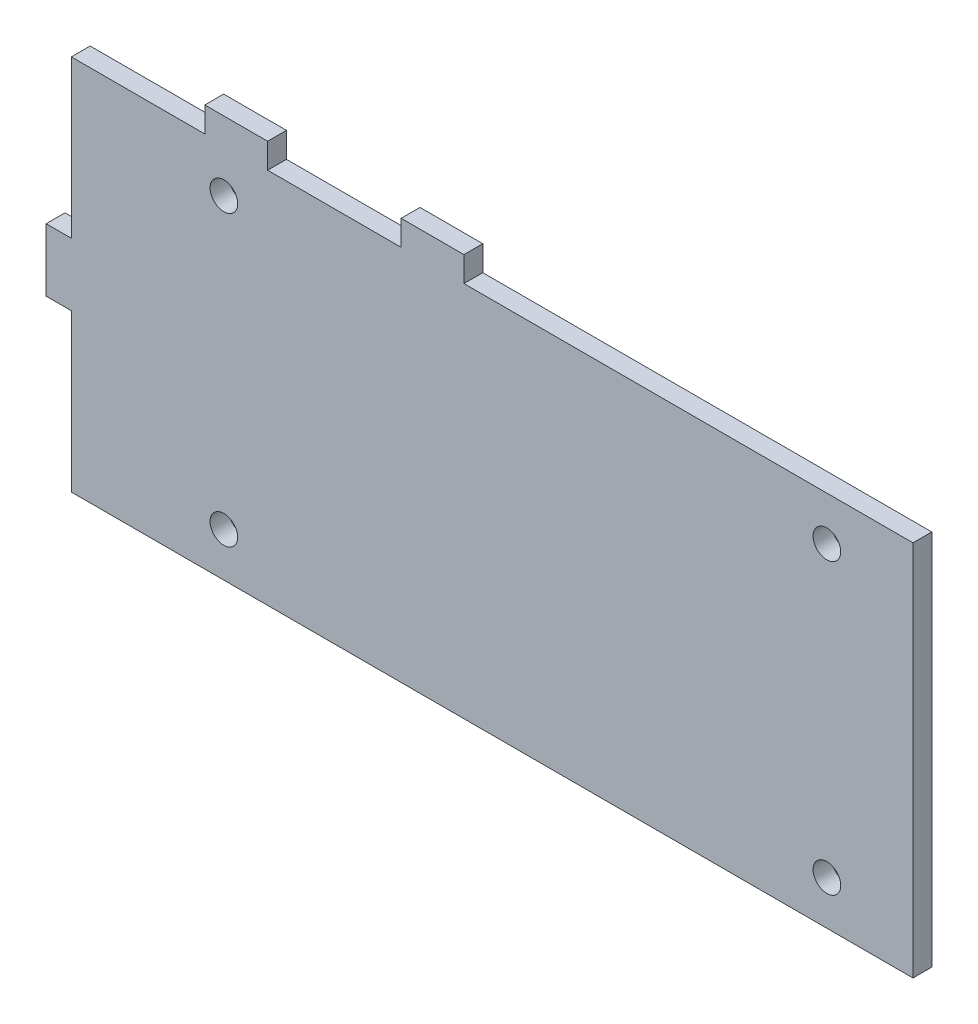
ISO-10303-21;
HEADER;
FILE_DESCRIPTION(('STEP AP214'),'2;1');
FILE_NAME('part.step','',(''),(''),'','','');
FILE_SCHEMA(('AUTOMOTIVE_DESIGN { 1 0 10303 214 1 1 1 1 }'));
ENDSEC;
DATA;
#1=APPLICATION_CONTEXT('core data for automotive mechanical design processes');
#2=APPLICATION_PROTOCOL_DEFINITION('international standard','automotive_design',2000,#1);
#3=PRODUCT_CONTEXT('',#1,'mechanical');
#4=PRODUCT('Part','Part','',(#3));
#5=PRODUCT_RELATED_PRODUCT_CATEGORY('part','',(#4));
#6=PRODUCT_DEFINITION_FORMATION('','',#4);
#7=PRODUCT_DEFINITION_CONTEXT('part definition',#1,'design');
#8=PRODUCT_DEFINITION('design','',#6,#7);
#9=PRODUCT_DEFINITION_SHAPE('','',#8);
#10=(LENGTH_UNIT() NAMED_UNIT(*) SI_UNIT(.MILLI.,.METRE.));
#11=(NAMED_UNIT(*) PLANE_ANGLE_UNIT() SI_UNIT($,.RADIAN.));
#12=(NAMED_UNIT(*) SI_UNIT($,.STERADIAN.) SOLID_ANGLE_UNIT());
#13=UNCERTAINTY_MEASURE_WITH_UNIT(LENGTH_MEASURE(1.E-05),#10,'distance_accuracy_value','');
#14=(GEOMETRIC_REPRESENTATION_CONTEXT(3) GLOBAL_UNCERTAINTY_ASSIGNED_CONTEXT((#13)) GLOBAL_UNIT_ASSIGNED_CONTEXT((#10,
#11,#12)) REPRESENTATION_CONTEXT('',''));
#15=CARTESIAN_POINT('',(0.,0.,0.));
#16=DIRECTION('',(0.,0.,1.));
#17=DIRECTION('',(1.,0.,0.));
#18=AXIS2_PLACEMENT_3D('',#15,#16,#17);
#19=CARTESIAN_POINT('',(11.8535533905939,-11.,13.5000000000004));
#20=DIRECTION('',(-1.,0.,0.));
#21=DIRECTION('',(0.,-1.,0.));
#22=AXIS2_PLACEMENT_3D('',#19,#20,#21);
#23=PLANE('',#22);
#24=DIRECTION('',(0.,-1.,0.));
#25=VECTOR('',#24,1.);
#26=CARTESIAN_POINT('',(11.8535533905939,-11.,13.5000000000004));
#27=LINE('',#26,#25);
#28=CARTESIAN_POINT('',(11.8535533905939,-11.,13.5000000000004));
#29=VERTEX_POINT('',#28);
#30=CARTESIAN_POINT('',(11.8535533905939,-23.5,13.5000000000004));
#31=VERTEX_POINT('',#30);
#32=EDGE_CURVE('E218',#29,#31,#27,.T.);
#33=ORIENTED_EDGE('',*,*,#32,.T.);
#34=DIRECTION('',(0.,0.,1.));
#35=VECTOR('',#34,1.);
#36=CARTESIAN_POINT('',(11.8535533905939,-23.5,13.5000000000004));
#37=LINE('',#36,#35);
#38=CARTESIAN_POINT('',(11.8535533905939,-23.5,15.0000000000004));
#39=VERTEX_POINT('',#38);
#40=EDGE_CURVE('E209',#31,#39,#37,.T.);
#41=ORIENTED_EDGE('',*,*,#40,.T.);
#42=DIRECTION('',(0.,-1.,0.));
#43=VECTOR('',#42,1.);
#44=CARTESIAN_POINT('',(11.8535533905939,-11.,15.0000000000004));
#45=LINE('',#44,#43);
#46=CARTESIAN_POINT('',(11.8535533905939,-11.,15.0000000000004));
#47=VERTEX_POINT('',#46);
#48=EDGE_CURVE('E239',#47,#39,#45,.T.);
#49=ORIENTED_EDGE('',*,*,#48,.F.);
#50=DIRECTION('',(0.,0.,1.));
#51=VECTOR('',#50,1.);
#52=CARTESIAN_POINT('',(11.8535533905939,-11.,13.5000000000004));
#53=LINE('',#52,#51);
#54=EDGE_CURVE('E11',#29,#47,#53,.T.);
#55=ORIENTED_EDGE('',*,*,#54,.F.);
#56=EDGE_LOOP('',(#33,#41,#49,#55));
#57=FACE_BOUND('',#56,.T.);
#58=ADVANCED_FACE('F44',(#57),#23,.T.);
#59=CARTESIAN_POINT('',(11.8535533905939,-11.,13.5000000000004));
#60=DIRECTION('',(0.,1.,0.));
#61=DIRECTION('',(0.,0.,1.));
#62=AXIS2_PLACEMENT_3D('',#59,#60,#61);
#63=PLANE('',#62);
#64=DIRECTION('',(0.,0.,1.));
#65=VECTOR('',#64,1.);
#66=CARTESIAN_POINT('',(38.1089177968646,-11.,13.5000000000004));
#67=LINE('',#66,#65);
#68=CARTESIAN_POINT('',(38.1089177968646,-11.,13.5000000000004));
#69=VERTEX_POINT('',#68);
#70=CARTESIAN_POINT('',(38.1089177968646,-11.,15.0000000000004));
#71=VERTEX_POINT('',#70);
#72=EDGE_CURVE('E293',#69,#71,#67,.T.);
#73=ORIENTED_EDGE('',*,*,#72,.F.);
#74=DIRECTION('',(-1.,0.,0.));
#75=VECTOR('',#74,1.);
#76=CARTESIAN_POINT('',(11.8535533905939,-11.,13.5000000000004));
#77=LINE('',#76,#75);
#78=CARTESIAN_POINT('',(27.4812355937292,-11.,13.5000000000004));
#79=VERTEX_POINT('',#78);
#80=EDGE_CURVE('E238',#69,#79,#77,.T.);
#81=ORIENTED_EDGE('',*,*,#80,.T.);
#82=DIRECTION('',(0.,0.,1.));
#83=VECTOR('',#82,1.);
#84=CARTESIAN_POINT('',(27.4812355937292,-11.,13.5000000000004));
#85=LINE('',#84,#83);
#86=CARTESIAN_POINT('',(27.4812355937292,-11.,15.0000000000004));
#87=VERTEX_POINT('',#86);
#88=EDGE_CURVE('E264',#79,#87,#85,.T.);
#89=ORIENTED_EDGE('',*,*,#88,.T.);
#90=DIRECTION('',(-1.,0.,0.));
#91=VECTOR('',#90,1.);
#92=CARTESIAN_POINT('',(11.8535533905939,-11.,15.0000000000004));
#93=LINE('',#92,#91);
#94=EDGE_CURVE('E223',#71,#87,#93,.T.);
#95=ORIENTED_EDGE('',*,*,#94,.F.);
#96=EDGE_LOOP('',(#73,#81,#89,#95));
#97=FACE_BOUND('',#96,.T.);
#98=ADVANCED_FACE('F361',(#97),#63,.T.);
#99=DIRECTION('',(0.,0.,1.));
#100=VECTOR('',#99,1.);
#101=CARTESIAN_POINT('',(43.1089177968646,-11.,13.5000000000004));
#102=LINE('',#101,#100);
#103=CARTESIAN_POINT('',(43.1089177968646,-11.,13.5000000000004));
#104=VERTEX_POINT('',#103);
#105=CARTESIAN_POINT('',(43.1089177968646,-11.,15.0000000000004));
#106=VERTEX_POINT('',#105);
#107=EDGE_CURVE('E295',#104,#106,#102,.T.);
#108=ORIENTED_EDGE('',*,*,#107,.T.);
#109=CARTESIAN_POINT('',(78.8535533905939,-11.,15.0000000000004));
#110=VERTEX_POINT('',#109);
#111=EDGE_CURVE('E219',#110,#106,#93,.T.);
#112=ORIENTED_EDGE('',*,*,#111,.F.);
#113=DIRECTION('',(0.,0.,1.));
#114=VECTOR('',#113,1.);
#115=CARTESIAN_POINT('',(78.8535533905939,-11.,13.5000000000004));
#116=LINE('',#115,#114);
#117=CARTESIAN_POINT('',(78.8535533905939,-11.,13.5000000000004));
#118=VERTEX_POINT('',#117);
#119=EDGE_CURVE('E53',#118,#110,#116,.T.);
#120=ORIENTED_EDGE('',*,*,#119,.F.);
#121=EDGE_CURVE('E235',#118,#104,#77,.T.);
#122=ORIENTED_EDGE('',*,*,#121,.T.);
#123=EDGE_LOOP('',(#108,#112,#120,#122));
#124=FACE_BOUND('',#123,.T.);
#125=ADVANCED_FACE('F382',(#124),#63,.T.);
#126=DIRECTION('',(0.,0.,1.));
#127=VECTOR('',#126,1.);
#128=CARTESIAN_POINT('',(11.8535533905939,-28.5,13.5000000000004));
#129=LINE('',#128,#127);
#130=CARTESIAN_POINT('',(11.8535533905939,-28.5,13.5000000000004));
#131=VERTEX_POINT('',#130);
#132=CARTESIAN_POINT('',(11.8535533905939,-28.5,15.0000000000004));
#133=VERTEX_POINT('',#132);
#134=EDGE_CURVE('E193',#131,#133,#129,.T.);
#135=ORIENTED_EDGE('',*,*,#134,.F.);
#136=CARTESIAN_POINT('',(11.8535533905939,-41.,13.5000000000004));
#137=VERTEX_POINT('',#136);
#138=EDGE_CURVE('E206',#131,#137,#27,.T.);
#139=ORIENTED_EDGE('',*,*,#138,.T.);
#140=DIRECTION('',(0.,0.,1.));
#141=VECTOR('',#140,1.);
#142=CARTESIAN_POINT('',(11.8535533905939,-41.,13.5000000000004));
#143=LINE('',#142,#141);
#144=CARTESIAN_POINT('',(11.8535533905939,-41.,15.0000000000004));
#145=VERTEX_POINT('',#144);
#146=EDGE_CURVE('E48',#137,#145,#143,.T.);
#147=ORIENTED_EDGE('',*,*,#146,.T.);
#148=EDGE_CURVE('E208',#133,#145,#45,.T.);
#149=ORIENTED_EDGE('',*,*,#148,.F.);
#150=EDGE_LOOP('',(#135,#139,#147,#149));
#151=FACE_BOUND('',#150,.T.);
#152=ADVANCED_FACE('F46',(#151),#23,.T.);
#153=DIRECTION('',(0.,0.,1.));
#154=VECTOR('',#153,1.);
#155=CARTESIAN_POINT('',(22.4812355937292,-11.,13.5000000000004));
#156=LINE('',#155,#154);
#157=CARTESIAN_POINT('',(22.4812355937292,-11.,13.5000000000004));
#158=VERTEX_POINT('',#157);
#159=CARTESIAN_POINT('',(22.4812355937292,-11.,15.0000000000004));
#160=VERTEX_POINT('',#159);
#161=EDGE_CURVE('E228',#158,#160,#156,.T.);
#162=ORIENTED_EDGE('',*,*,#161,.F.);
#163=EDGE_CURVE('E234',#158,#29,#77,.T.);
#164=ORIENTED_EDGE('',*,*,#163,.T.);
#165=ORIENTED_EDGE('',*,*,#54,.T.);
#166=EDGE_CURVE('E225',#160,#47,#93,.T.);
#167=ORIENTED_EDGE('',*,*,#166,.F.);
#168=EDGE_LOOP('',(#162,#164,#165,#167));
#169=FACE_BOUND('',#168,.T.);
#170=ADVANCED_FACE('F384',(#169),#63,.T.);
#171=CARTESIAN_POINT('',(78.8535533905939,-11.,13.5000000000004));
#172=DIRECTION('',(1.,0.,0.));
#173=DIRECTION('',(0.,0.,-1.));
#174=AXIS2_PLACEMENT_3D('',#171,#172,#173);
#175=PLANE('',#174);
#176=DIRECTION('',(0.,1.,0.));
#177=VECTOR('',#176,1.);
#178=CARTESIAN_POINT('',(78.8535533905939,-11.,15.0000000000004));
#179=LINE('',#178,#177);
#180=CARTESIAN_POINT('',(78.8535533905939,-41.,15.0000000000004));
#181=VERTEX_POINT('',#180);
#182=EDGE_CURVE('E245',#181,#110,#179,.T.);
#183=ORIENTED_EDGE('',*,*,#182,.F.);
#184=DIRECTION('',(0.,0.,1.));
#185=VECTOR('',#184,1.);
#186=CARTESIAN_POINT('',(78.8535533905939,-41.,13.5000000000004));
#187=LINE('',#186,#185);
#188=CARTESIAN_POINT('',(78.8535533905939,-41.,13.5000000000004));
#189=VERTEX_POINT('',#188);
#190=EDGE_CURVE('E248',#189,#181,#187,.T.);
#191=ORIENTED_EDGE('',*,*,#190,.F.);
#192=DIRECTION('',(0.,1.,0.));
#193=VECTOR('',#192,1.);
#194=CARTESIAN_POINT('',(78.8535533905939,-11.,13.5000000000004));
#195=LINE('',#194,#193);
#196=EDGE_CURVE('E231',#189,#118,#195,.T.);
#197=ORIENTED_EDGE('',*,*,#196,.T.);
#198=ORIENTED_EDGE('',*,*,#119,.T.);
#199=EDGE_LOOP('',(#183,#191,#197,#198));
#200=FACE_BOUND('',#199,.T.);
#201=ADVANCED_FACE('F390',(#200),#175,.T.);
#202=CARTESIAN_POINT('',(11.8535533905939,-41.,13.5000000000004));
#203=DIRECTION('',(0.,-1.,0.));
#204=DIRECTION('',(0.,0.,-1.));
#205=AXIS2_PLACEMENT_3D('',#202,#203,#204);
#206=PLANE('',#205);
#207=DIRECTION('',(1.,0.,0.));
#208=VECTOR('',#207,1.);
#209=CARTESIAN_POINT('',(11.8535533905939,-41.,15.0000000000004));
#210=LINE('',#209,#208);
#211=EDGE_CURVE('E242',#145,#181,#210,.T.);
#212=ORIENTED_EDGE('',*,*,#211,.F.);
#213=ORIENTED_EDGE('',*,*,#146,.F.);
#214=DIRECTION('',(1.,0.,0.));
#215=VECTOR('',#214,1.);
#216=CARTESIAN_POINT('',(11.8535533905939,-41.,13.5000000000004));
#217=LINE('',#216,#215);
#218=EDGE_CURVE('E217',#137,#189,#217,.T.);
#219=ORIENTED_EDGE('',*,*,#218,.T.);
#220=ORIENTED_EDGE('',*,*,#190,.T.);
#221=EDGE_LOOP('',(#212,#213,#219,#220));
#222=FACE_BOUND('',#221,.T.);
#223=ADVANCED_FACE('F252',(#222),#206,.T.);
#224=CARTESIAN_POINT('',(0.,0.,13.5000000000004));
#225=DIRECTION('',(0.,0.,1.));
#226=DIRECTION('',(1.,0.,0.));
#227=AXIS2_PLACEMENT_3D('',#224,#225,#226);
#228=PLANE('',#227);
#229=CARTESIAN_POINT('',(72.0000000000018,-37.4999999999996,13.5000000000004));
#230=DIRECTION('',(0.,0.,1.));
#231=DIRECTION('',(1.,0.,0.));
#232=AXIS2_PLACEMENT_3D('',#229,#230,#231);
#233=CIRCLE('',#232,1.09999999999999);
#234=CARTESIAN_POINT('',(73.1000000000018,-37.4999999999996,13.5000000000004));
#235=VERTEX_POINT('',#234);
#236=EDGE_CURVE('E333',#235,#235,#233,.T.);
#237=ORIENTED_EDGE('',*,*,#236,.T.);
#238=EDGE_LOOP('',(#237));
#239=FACE_BOUND('',#238,.T.);
#240=CARTESIAN_POINT('',(24.0000000000018,-37.4999999999996,13.5000000000004));
#241=DIRECTION('',(0.,0.,1.));
#242=DIRECTION('',(1.,0.,0.));
#243=AXIS2_PLACEMENT_3D('',#240,#241,#242);
#244=CIRCLE('',#243,1.09999999999999);
#245=CARTESIAN_POINT('',(25.1000000000018,-37.4999999999996,13.5000000000004));
#246=VERTEX_POINT('',#245);
#247=EDGE_CURVE('E327',#246,#246,#244,.T.);
#248=ORIENTED_EDGE('',*,*,#247,.T.);
#249=EDGE_LOOP('',(#248));
#250=FACE_BOUND('',#249,.T.);
#251=CARTESIAN_POINT('',(72.0000000000018,-14.4999999999995,13.5000000000004));
#252=DIRECTION('',(0.,0.,1.));
#253=DIRECTION('',(1.,0.,0.));
#254=AXIS2_PLACEMENT_3D('',#251,#252,#253);
#255=CIRCLE('',#254,1.09999999999999);
#256=CARTESIAN_POINT('',(73.1000000000018,-14.4999999999995,13.5000000000004));
#257=VERTEX_POINT('',#256);
#258=EDGE_CURVE('E321',#257,#257,#255,.T.);
#259=ORIENTED_EDGE('',*,*,#258,.T.);
#260=EDGE_LOOP('',(#259));
#261=FACE_BOUND('',#260,.T.);
#262=CARTESIAN_POINT('',(24.0000000000018,-14.4999999999995,13.5000000000004));
#263=DIRECTION('',(0.,0.,1.));
#264=DIRECTION('',(1.,0.,0.));
#265=AXIS2_PLACEMENT_3D('',#262,#263,#264);
#266=CIRCLE('',#265,1.09999999999999);
#267=CARTESIAN_POINT('',(25.1000000000018,-14.4999999999995,13.5000000000004));
#268=VERTEX_POINT('',#267);
#269=EDGE_CURVE('E309',#268,#268,#266,.T.);
#270=ORIENTED_EDGE('',*,*,#269,.T.);
#271=EDGE_LOOP('',(#270));
#272=FACE_BOUND('',#271,.T.);
#273=ORIENTED_EDGE('',*,*,#32,.F.);
#274=ORIENTED_EDGE('',*,*,#163,.F.);
#275=DIRECTION('',(0.,-1.,0.));
#276=VECTOR('',#275,1.);
#277=CARTESIAN_POINT('',(22.4812355937292,-11.,13.5000000000004));
#278=LINE('',#277,#276);
#279=CARTESIAN_POINT('',(22.4812355937292,-8.99999999999997,13.5000000000004));
#280=VERTEX_POINT('',#279);
#281=EDGE_CURVE('E281',#280,#158,#278,.T.);
#282=ORIENTED_EDGE('',*,*,#281,.F.);
#283=DIRECTION('',(-1.,0.,0.));
#284=VECTOR('',#283,1.);
#285=CARTESIAN_POINT('',(22.4812355937292,-8.99999999999997,13.5000000000004));
#286=LINE('',#285,#284);
#287=CARTESIAN_POINT('',(27.4812355937292,-8.99999999999997,13.5000000000004));
#288=VERTEX_POINT('',#287);
#289=EDGE_CURVE('E273',#288,#280,#286,.T.);
#290=ORIENTED_EDGE('',*,*,#289,.F.);
#291=DIRECTION('',(0.,1.,0.));
#292=VECTOR('',#291,1.);
#293=CARTESIAN_POINT('',(27.4812355937292,-11.,13.5000000000004));
#294=LINE('',#293,#292);
#295=EDGE_CURVE('E277',#79,#288,#294,.T.);
#296=ORIENTED_EDGE('',*,*,#295,.F.);
#297=ORIENTED_EDGE('',*,*,#80,.F.);
#298=DIRECTION('',(0.,-1.,0.));
#299=VECTOR('',#298,1.);
#300=CARTESIAN_POINT('',(38.1089177968646,-11.,13.5000000000004));
#301=LINE('',#300,#299);
#302=CARTESIAN_POINT('',(38.1089177968646,-8.99999999999997,13.5000000000004));
#303=VERTEX_POINT('',#302);
#304=EDGE_CURVE('E304',#303,#69,#301,.T.);
#305=ORIENTED_EDGE('',*,*,#304,.F.);
#306=DIRECTION('',(-1.,0.,0.));
#307=VECTOR('',#306,1.);
#308=CARTESIAN_POINT('',(38.1089177968646,-8.99999999999997,13.5000000000004));
#309=LINE('',#308,#307);
#310=CARTESIAN_POINT('',(43.1089177968646,-8.99999999999997,13.5000000000004));
#311=VERTEX_POINT('',#310);
#312=EDGE_CURVE('E296',#311,#303,#309,.T.);
#313=ORIENTED_EDGE('',*,*,#312,.F.);
#314=DIRECTION('',(0.,1.,0.));
#315=VECTOR('',#314,1.);
#316=CARTESIAN_POINT('',(43.1089177968646,-11.,13.5000000000004));
#317=LINE('',#316,#315);
#318=EDGE_CURVE('E312',#104,#311,#317,.T.);
#319=ORIENTED_EDGE('',*,*,#318,.F.);
#320=ORIENTED_EDGE('',*,*,#121,.F.);
#321=ORIENTED_EDGE('',*,*,#196,.F.);
#322=ORIENTED_EDGE('',*,*,#218,.F.);
#323=ORIENTED_EDGE('',*,*,#138,.F.);
#324=DIRECTION('',(1.,0.,0.));
#325=VECTOR('',#324,1.);
#326=CARTESIAN_POINT('',(11.8535533905939,-28.5,13.5000000000004));
#327=LINE('',#326,#325);
#328=CARTESIAN_POINT('',(9.85355339059389,-28.5,13.5000000000004));
#329=VERTEX_POINT('',#328);
#330=EDGE_CURVE('E189',#329,#131,#327,.T.);
#331=ORIENTED_EDGE('',*,*,#330,.F.);
#332=DIRECTION('',(0.,-1.,0.));
#333=VECTOR('',#332,1.);
#334=CARTESIAN_POINT('',(9.85355339059389,-28.5,13.5000000000004));
#335=LINE('',#334,#333);
#336=CARTESIAN_POINT('',(9.85355339059389,-23.5,13.5000000000004));
#337=VERTEX_POINT('',#336);
#338=EDGE_CURVE('E210',#337,#329,#335,.T.);
#339=ORIENTED_EDGE('',*,*,#338,.F.);
#340=DIRECTION('',(-1.,0.,0.));
#341=VECTOR('',#340,1.);
#342=CARTESIAN_POINT('',(11.8535533905939,-23.5,13.5000000000004));
#343=LINE('',#342,#341);
#344=EDGE_CURVE('E200',#31,#337,#343,.T.);
#345=ORIENTED_EDGE('',*,*,#344,.F.);
#346=EDGE_LOOP('',(#273,#274,#282,#290,#296,#297,#305,#313,#319,#320,#321,#322,#323,#331,#339,#345));
#347=FACE_BOUND('',#346,.T.);
#348=ADVANCED_FACE('F214',(#239,#250,#261,#272,#347),#228,.F.);
#349=CARTESIAN_POINT('',(0.,0.,15.0000000000004));
#350=DIRECTION('',(0.,0.,1.));
#351=DIRECTION('',(1.,0.,0.));
#352=AXIS2_PLACEMENT_3D('',#349,#350,#351);
#353=PLANE('',#352);
#354=CARTESIAN_POINT('',(72.0000000000018,-37.4999999999996,15.0000000000004));
#355=DIRECTION('',(0.,0.,1.));
#356=DIRECTION('',(1.,0.,0.));
#357=AXIS2_PLACEMENT_3D('',#354,#355,#356);
#358=CIRCLE('',#357,1.09999999999999);
#359=CARTESIAN_POINT('',(73.1000000000018,-37.4999999999996,15.0000000000004));
#360=VERTEX_POINT('',#359);
#361=EDGE_CURVE('E336',#360,#360,#358,.T.);
#362=ORIENTED_EDGE('',*,*,#361,.F.);
#363=EDGE_LOOP('',(#362));
#364=FACE_BOUND('',#363,.T.);
#365=CARTESIAN_POINT('',(24.0000000000018,-37.4999999999996,15.0000000000004));
#366=DIRECTION('',(0.,0.,1.));
#367=DIRECTION('',(1.,0.,0.));
#368=AXIS2_PLACEMENT_3D('',#365,#366,#367);
#369=CIRCLE('',#368,1.09999999999999);
#370=CARTESIAN_POINT('',(25.1000000000018,-37.4999999999996,15.0000000000004));
#371=VERTEX_POINT('',#370);
#372=EDGE_CURVE('E330',#371,#371,#369,.T.);
#373=ORIENTED_EDGE('',*,*,#372,.F.);
#374=EDGE_LOOP('',(#373));
#375=FACE_BOUND('',#374,.T.);
#376=CARTESIAN_POINT('',(72.0000000000018,-14.4999999999995,15.0000000000004));
#377=DIRECTION('',(0.,0.,1.));
#378=DIRECTION('',(1.,0.,0.));
#379=AXIS2_PLACEMENT_3D('',#376,#377,#378);
#380=CIRCLE('',#379,1.09999999999999);
#381=CARTESIAN_POINT('',(73.1000000000018,-14.4999999999995,15.0000000000004));
#382=VERTEX_POINT('',#381);
#383=EDGE_CURVE('E324',#382,#382,#380,.T.);
#384=ORIENTED_EDGE('',*,*,#383,.F.);
#385=EDGE_LOOP('',(#384));
#386=FACE_BOUND('',#385,.T.);
#387=CARTESIAN_POINT('',(24.0000000000018,-14.4999999999995,15.0000000000004));
#388=DIRECTION('',(0.,0.,1.));
#389=DIRECTION('',(1.,0.,0.));
#390=AXIS2_PLACEMENT_3D('',#387,#388,#389);
#391=CIRCLE('',#390,1.09999999999999);
#392=CARTESIAN_POINT('',(25.1000000000018,-14.4999999999995,15.0000000000004));
#393=VERTEX_POINT('',#392);
#394=EDGE_CURVE('E318',#393,#393,#391,.T.);
#395=ORIENTED_EDGE('',*,*,#394,.F.);
#396=EDGE_LOOP('',(#395));
#397=FACE_BOUND('',#396,.T.);
#398=ORIENTED_EDGE('',*,*,#48,.T.);
#399=DIRECTION('',(-1.,0.,0.));
#400=VECTOR('',#399,1.);
#401=CARTESIAN_POINT('',(11.8535533905939,-23.5,15.0000000000004));
#402=LINE('',#401,#400);
#403=CARTESIAN_POINT('',(9.85355339059389,-23.5,15.0000000000004));
#404=VERTEX_POINT('',#403);
#405=EDGE_CURVE('E65',#39,#404,#402,.T.);
#406=ORIENTED_EDGE('',*,*,#405,.T.);
#407=DIRECTION('',(0.,-1.,0.));
#408=VECTOR('',#407,1.);
#409=CARTESIAN_POINT('',(9.85355339059389,-28.5,15.0000000000004));
#410=LINE('',#409,#408);
#411=CARTESIAN_POINT('',(9.85355339059389,-28.5,15.0000000000004));
#412=VERTEX_POINT('',#411);
#413=EDGE_CURVE('E201',#404,#412,#410,.T.);
#414=ORIENTED_EDGE('',*,*,#413,.T.);
#415=DIRECTION('',(1.,0.,0.));
#416=VECTOR('',#415,1.);
#417=CARTESIAN_POINT('',(11.8535533905939,-28.5,15.0000000000004));
#418=LINE('',#417,#416);
#419=EDGE_CURVE('E256',#412,#133,#418,.T.);
#420=ORIENTED_EDGE('',*,*,#419,.T.);
#421=ORIENTED_EDGE('',*,*,#148,.T.);
#422=ORIENTED_EDGE('',*,*,#211,.T.);
#423=ORIENTED_EDGE('',*,*,#182,.T.);
#424=ORIENTED_EDGE('',*,*,#111,.T.);
#425=DIRECTION('',(0.,1.,0.));
#426=VECTOR('',#425,1.);
#427=CARTESIAN_POINT('',(43.1089177968646,-11.,15.0000000000004));
#428=LINE('',#427,#426);
#429=CARTESIAN_POINT('',(43.1089177968646,-8.99999999999997,15.0000000000004));
#430=VERTEX_POINT('',#429);
#431=EDGE_CURVE('E305',#106,#430,#428,.T.);
#432=ORIENTED_EDGE('',*,*,#431,.T.);
#433=DIRECTION('',(-1.,0.,0.));
#434=VECTOR('',#433,1.);
#435=CARTESIAN_POINT('',(38.1089177968646,-8.99999999999997,15.0000000000004));
#436=LINE('',#435,#434);
#437=CARTESIAN_POINT('',(38.1089177968646,-8.99999999999997,15.0000000000004));
#438=VERTEX_POINT('',#437);
#439=EDGE_CURVE('E302',#430,#438,#436,.T.);
#440=ORIENTED_EDGE('',*,*,#439,.T.);
#441=DIRECTION('',(0.,-1.,0.));
#442=VECTOR('',#441,1.);
#443=CARTESIAN_POINT('',(38.1089177968646,-11.,15.0000000000004));
#444=LINE('',#443,#442);
#445=EDGE_CURVE('E77',#438,#71,#444,.T.);
#446=ORIENTED_EDGE('',*,*,#445,.T.);
#447=ORIENTED_EDGE('',*,*,#94,.T.);
#448=DIRECTION('',(0.,1.,0.));
#449=VECTOR('',#448,1.);
#450=CARTESIAN_POINT('',(27.4812355937292,-11.,15.0000000000004));
#451=LINE('',#450,#449);
#452=CARTESIAN_POINT('',(27.4812355937292,-8.99999999999997,15.0000000000004));
#453=VERTEX_POINT('',#452);
#454=EDGE_CURVE('E286',#87,#453,#451,.T.);
#455=ORIENTED_EDGE('',*,*,#454,.T.);
#456=DIRECTION('',(-1.,0.,0.));
#457=VECTOR('',#456,1.);
#458=CARTESIAN_POINT('',(22.4812355937292,-8.99999999999997,15.0000000000004));
#459=LINE('',#458,#457);
#460=CARTESIAN_POINT('',(22.4812355937292,-8.99999999999997,15.0000000000004));
#461=VERTEX_POINT('',#460);
#462=EDGE_CURVE('E267',#453,#461,#459,.T.);
#463=ORIENTED_EDGE('',*,*,#462,.T.);
#464=DIRECTION('',(0.,-1.,0.));
#465=VECTOR('',#464,1.);
#466=CARTESIAN_POINT('',(22.4812355937292,-11.,15.0000000000004));
#467=LINE('',#466,#465);
#468=EDGE_CURVE('E285',#461,#160,#467,.T.);
#469=ORIENTED_EDGE('',*,*,#468,.T.);
#470=ORIENTED_EDGE('',*,*,#166,.T.);
#471=EDGE_LOOP('',(#398,#406,#414,#420,#421,#422,#423,#424,#432,#440,#446,#447,#455,#463,#469,#470));
#472=FACE_BOUND('',#471,.T.);
#473=ADVANCED_FACE('F253',(#364,#375,#386,#397,#472),#353,.T.);
#474=CARTESIAN_POINT('',(22.4812355937292,-11.,13.5000000000004));
#475=DIRECTION('',(-1.,0.,0.));
#476=DIRECTION('',(0.,0.,1.));
#477=AXIS2_PLACEMENT_3D('',#474,#475,#476);
#478=PLANE('',#477);
#479=ORIENTED_EDGE('',*,*,#468,.F.);
#480=DIRECTION('',(0.,0.,1.));
#481=VECTOR('',#480,1.);
#482=CARTESIAN_POINT('',(22.4812355937292,-8.99999999999997,13.5000000000004));
#483=LINE('',#482,#481);
#484=EDGE_CURVE('E257',#280,#461,#483,.T.);
#485=ORIENTED_EDGE('',*,*,#484,.F.);
#486=ORIENTED_EDGE('',*,*,#281,.T.);
#487=ORIENTED_EDGE('',*,*,#161,.T.);
#488=EDGE_LOOP('',(#479,#485,#486,#487));
#489=FACE_BOUND('',#488,.T.);
#490=ADVANCED_FACE('F368',(#489),#478,.T.);
#491=CARTESIAN_POINT('',(22.4812355937292,-8.99999999999997,13.5000000000004));
#492=DIRECTION('',(0.,1.,0.));
#493=DIRECTION('',(0.,0.,1.));
#494=AXIS2_PLACEMENT_3D('',#491,#492,#493);
#495=PLANE('',#494);
#496=ORIENTED_EDGE('',*,*,#462,.F.);
#497=DIRECTION('',(0.,0.,1.));
#498=VECTOR('',#497,1.);
#499=CARTESIAN_POINT('',(27.4812355937292,-8.99999999999997,13.5000000000004));
#500=LINE('',#499,#498);
#501=EDGE_CURVE('E258',#288,#453,#500,.T.);
#502=ORIENTED_EDGE('',*,*,#501,.F.);
#503=ORIENTED_EDGE('',*,*,#289,.T.);
#504=ORIENTED_EDGE('',*,*,#484,.T.);
#505=EDGE_LOOP('',(#496,#502,#503,#504));
#506=FACE_BOUND('',#505,.T.);
#507=ADVANCED_FACE('F366',(#506),#495,.T.);
#508=CARTESIAN_POINT('',(27.4812355937292,-11.,13.5000000000004));
#509=DIRECTION('',(1.,0.,0.));
#510=DIRECTION('',(0.,0.,-1.));
#511=AXIS2_PLACEMENT_3D('',#508,#509,#510);
#512=PLANE('',#511);
#513=ORIENTED_EDGE('',*,*,#454,.F.);
#514=ORIENTED_EDGE('',*,*,#88,.F.);
#515=ORIENTED_EDGE('',*,*,#295,.T.);
#516=ORIENTED_EDGE('',*,*,#501,.T.);
#517=EDGE_LOOP('',(#513,#514,#515,#516));
#518=FACE_BOUND('',#517,.T.);
#519=ADVANCED_FACE('F365',(#518),#512,.T.);
#520=CARTESIAN_POINT('',(38.1089177968646,-11.,13.5000000000004));
#521=DIRECTION('',(-1.,0.,0.));
#522=DIRECTION('',(0.,0.,1.));
#523=AXIS2_PLACEMENT_3D('',#520,#521,#522);
#524=PLANE('',#523);
#525=ORIENTED_EDGE('',*,*,#445,.F.);
#526=DIRECTION('',(0.,0.,1.));
#527=VECTOR('',#526,1.);
#528=CARTESIAN_POINT('',(38.1089177968646,-8.99999999999997,13.5000000000004));
#529=LINE('',#528,#527);
#530=EDGE_CURVE('E287',#303,#438,#529,.T.);
#531=ORIENTED_EDGE('',*,*,#530,.F.);
#532=ORIENTED_EDGE('',*,*,#304,.T.);
#533=ORIENTED_EDGE('',*,*,#72,.T.);
#534=EDGE_LOOP('',(#525,#531,#532,#533));
#535=FACE_BOUND('',#534,.T.);
#536=ADVANCED_FACE('F374',(#535),#524,.T.);
#537=CARTESIAN_POINT('',(38.1089177968646,-8.99999999999997,13.5000000000004));
#538=DIRECTION('',(0.,1.,0.));
#539=DIRECTION('',(0.,0.,1.));
#540=AXIS2_PLACEMENT_3D('',#537,#538,#539);
#541=PLANE('',#540);
#542=ORIENTED_EDGE('',*,*,#439,.F.);
#543=DIRECTION('',(0.,0.,1.));
#544=VECTOR('',#543,1.);
#545=CARTESIAN_POINT('',(43.1089177968646,-8.99999999999997,13.5000000000004));
#546=LINE('',#545,#544);
#547=EDGE_CURVE('E299',#311,#430,#546,.T.);
#548=ORIENTED_EDGE('',*,*,#547,.F.);
#549=ORIENTED_EDGE('',*,*,#312,.T.);
#550=ORIENTED_EDGE('',*,*,#530,.T.);
#551=EDGE_LOOP('',(#542,#548,#549,#550));
#552=FACE_BOUND('',#551,.T.);
#553=ADVANCED_FACE('F429',(#552),#541,.T.);
#554=CARTESIAN_POINT('',(43.1089177968646,-11.,13.5000000000004));
#555=DIRECTION('',(1.,0.,0.));
#556=DIRECTION('',(0.,0.,-1.));
#557=AXIS2_PLACEMENT_3D('',#554,#555,#556);
#558=PLANE('',#557);
#559=ORIENTED_EDGE('',*,*,#431,.F.);
#560=ORIENTED_EDGE('',*,*,#107,.F.);
#561=ORIENTED_EDGE('',*,*,#318,.T.);
#562=ORIENTED_EDGE('',*,*,#547,.T.);
#563=EDGE_LOOP('',(#559,#560,#561,#562));
#564=FACE_BOUND('',#563,.T.);
#565=ADVANCED_FACE('F419',(#564),#558,.T.);
#566=CARTESIAN_POINT('',(24.0000000000018,-14.4999999999995,15.0000000000004));
#567=DIRECTION('',(0.,0.,1.));
#568=DIRECTION('',(1.,0.,0.));
#569=AXIS2_PLACEMENT_3D('',#566,#567,#568);
#570=CYLINDRICAL_SURFACE('',#569,1.09999999999999);
#571=ORIENTED_EDGE('',*,*,#394,.T.);
#572=EDGE_LOOP('',(#571));
#573=FACE_BOUND('',#572,.T.);
#574=ORIENTED_EDGE('',*,*,#269,.F.);
#575=EDGE_LOOP('',(#574));
#576=FACE_BOUND('',#575,.T.);
#577=ADVANCED_FACE('F416',(#573,#576),#570,.F.);
#578=CARTESIAN_POINT('',(72.0000000000018,-14.4999999999995,15.0000000000004));
#579=DIRECTION('',(0.,0.,1.));
#580=DIRECTION('',(1.,0.,0.));
#581=AXIS2_PLACEMENT_3D('',#578,#579,#580);
#582=CYLINDRICAL_SURFACE('',#581,1.09999999999999);
#583=ORIENTED_EDGE('',*,*,#383,.T.);
#584=EDGE_LOOP('',(#583));
#585=FACE_BOUND('',#584,.T.);
#586=ORIENTED_EDGE('',*,*,#258,.F.);
#587=EDGE_LOOP('',(#586));
#588=FACE_BOUND('',#587,.T.);
#589=ADVANCED_FACE('F418',(#585,#588),#582,.F.);
#590=CARTESIAN_POINT('',(24.0000000000018,-37.4999999999996,15.0000000000004));
#591=DIRECTION('',(0.,0.,1.));
#592=DIRECTION('',(1.,0.,0.));
#593=AXIS2_PLACEMENT_3D('',#590,#591,#592);
#594=CYLINDRICAL_SURFACE('',#593,1.09999999999999);
#595=ORIENTED_EDGE('',*,*,#372,.T.);
#596=EDGE_LOOP('',(#595));
#597=FACE_BOUND('',#596,.T.);
#598=ORIENTED_EDGE('',*,*,#247,.F.);
#599=EDGE_LOOP('',(#598));
#600=FACE_BOUND('',#599,.T.);
#601=ADVANCED_FACE('F426',(#597,#600),#594,.F.);
#602=CARTESIAN_POINT('',(72.0000000000018,-37.4999999999996,15.0000000000004));
#603=DIRECTION('',(0.,0.,1.));
#604=DIRECTION('',(1.,0.,0.));
#605=AXIS2_PLACEMENT_3D('',#602,#603,#604);
#606=CYLINDRICAL_SURFACE('',#605,1.09999999999999);
#607=ORIENTED_EDGE('',*,*,#361,.T.);
#608=EDGE_LOOP('',(#607));
#609=FACE_BOUND('',#608,.T.);
#610=ORIENTED_EDGE('',*,*,#236,.F.);
#611=EDGE_LOOP('',(#610));
#612=FACE_BOUND('',#611,.T.);
#613=ADVANCED_FACE('F486',(#609,#612),#606,.F.);
#614=CARTESIAN_POINT('',(11.8535533905939,-28.5,13.5000000000004));
#615=DIRECTION('',(0.,-1.,0.));
#616=DIRECTION('',(0.,0.,-1.));
#617=AXIS2_PLACEMENT_3D('',#614,#615,#616);
#618=PLANE('',#617);
#619=ORIENTED_EDGE('',*,*,#419,.F.);
#620=DIRECTION('',(0.,0.,1.));
#621=VECTOR('',#620,1.);
#622=CARTESIAN_POINT('',(9.85355339059389,-28.5,13.5000000000004));
#623=LINE('',#622,#621);
#624=EDGE_CURVE('E195',#329,#412,#623,.T.);
#625=ORIENTED_EDGE('',*,*,#624,.F.);
#626=ORIENTED_EDGE('',*,*,#330,.T.);
#627=ORIENTED_EDGE('',*,*,#134,.T.);
#628=EDGE_LOOP('',(#619,#625,#626,#627));
#629=FACE_BOUND('',#628,.T.);
#630=ADVANCED_FACE('F192',(#629),#618,.T.);
#631=CARTESIAN_POINT('',(9.85355339059389,-28.5,13.5000000000004));
#632=DIRECTION('',(-1.,0.,0.));
#633=DIRECTION('',(0.,0.,1.));
#634=AXIS2_PLACEMENT_3D('',#631,#632,#633);
#635=PLANE('',#634);
#636=ORIENTED_EDGE('',*,*,#413,.F.);
#637=DIRECTION('',(0.,0.,1.));
#638=VECTOR('',#637,1.);
#639=CARTESIAN_POINT('',(9.85355339059389,-23.5,13.5000000000004));
#640=LINE('',#639,#638);
#641=EDGE_CURVE('E340',#337,#404,#640,.T.);
#642=ORIENTED_EDGE('',*,*,#641,.F.);
#643=ORIENTED_EDGE('',*,*,#338,.T.);
#644=ORIENTED_EDGE('',*,*,#624,.T.);
#645=EDGE_LOOP('',(#636,#642,#643,#644));
#646=FACE_BOUND('',#645,.T.);
#647=ADVANCED_FACE('F352',(#646),#635,.T.);
#648=CARTESIAN_POINT('',(11.8535533905939,-23.5,13.5000000000004));
#649=DIRECTION('',(0.,1.,0.));
#650=DIRECTION('',(0.,0.,1.));
#651=AXIS2_PLACEMENT_3D('',#648,#649,#650);
#652=PLANE('',#651);
#653=ORIENTED_EDGE('',*,*,#405,.F.);
#654=ORIENTED_EDGE('',*,*,#40,.F.);
#655=ORIENTED_EDGE('',*,*,#344,.T.);
#656=ORIENTED_EDGE('',*,*,#641,.T.);
#657=EDGE_LOOP('',(#653,#654,#655,#656));
#658=FACE_BOUND('',#657,.T.);
#659=ADVANCED_FACE('F349',(#658),#652,.T.);
#660=CLOSED_SHELL('',(#58,#98,#125,#152,#170,#201,#223,#348,#473,#490,#507,#519,#536,#553,#565,
#577,#589,#601,#613,#630,#647,#659));
#661=MANIFOLD_SOLID_BREP('B2',#660);
#662=ADVANCED_BREP_SHAPE_REPRESENTATION('',(#18,#661),#14);
#663=SHAPE_DEFINITION_REPRESENTATION(#9,#662);
ENDSEC;
END-ISO-10303-21;
